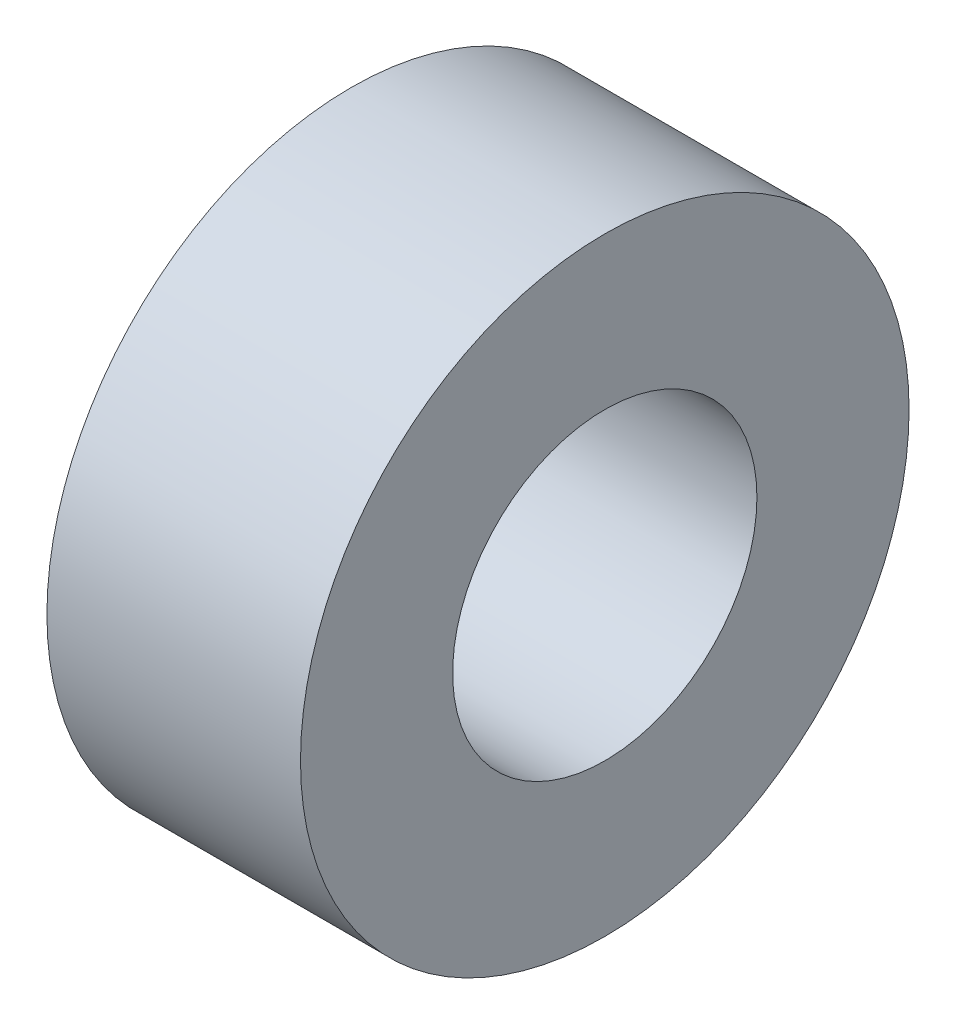
ISO-10303-21;
HEADER;
FILE_DESCRIPTION(('STEP AP214'),'2;1');
FILE_NAME('part.step','',(''),(''),'','','');
FILE_SCHEMA(('AUTOMOTIVE_DESIGN { 1 0 10303 214 1 1 1 1 }'));
ENDSEC;
DATA;
#1=APPLICATION_CONTEXT('core data for automotive mechanical design processes');
#2=APPLICATION_PROTOCOL_DEFINITION('international standard','automotive_design',2000,#1);
#3=PRODUCT_CONTEXT('',#1,'mechanical');
#4=PRODUCT('Part','Part','',(#3));
#5=PRODUCT_RELATED_PRODUCT_CATEGORY('part','',(#4));
#6=PRODUCT_DEFINITION_FORMATION('','',#4);
#7=PRODUCT_DEFINITION_CONTEXT('part definition',#1,'design');
#8=PRODUCT_DEFINITION('design','',#6,#7);
#9=PRODUCT_DEFINITION_SHAPE('','',#8);
#10=(LENGTH_UNIT() NAMED_UNIT(*) SI_UNIT(.MILLI.,.METRE.));
#11=(NAMED_UNIT(*) PLANE_ANGLE_UNIT() SI_UNIT($,.RADIAN.));
#12=(NAMED_UNIT(*) SI_UNIT($,.STERADIAN.) SOLID_ANGLE_UNIT());
#13=UNCERTAINTY_MEASURE_WITH_UNIT(LENGTH_MEASURE(1.E-05),#10,'distance_accuracy_value','');
#14=(GEOMETRIC_REPRESENTATION_CONTEXT(3) GLOBAL_UNCERTAINTY_ASSIGNED_CONTEXT((#13)) GLOBAL_UNIT_ASSIGNED_CONTEXT((#10,
#11,#12)) REPRESENTATION_CONTEXT('',''));
#15=CARTESIAN_POINT('',(0.,0.,0.));
#16=DIRECTION('',(0.,0.,1.));
#17=DIRECTION('',(1.,0.,0.));
#18=AXIS2_PLACEMENT_3D('',#15,#16,#17);
#19=CARTESIAN_POINT('',(1.25,3.,0.));
#20=DIRECTION('',(-1.,0.,0.));
#21=DIRECTION('',(0.,0.,1.));
#22=AXIS2_PLACEMENT_3D('',#19,#20,#21);
#23=PLANE('',#22);
#24=CARTESIAN_POINT('',(1.25,0.,0.));
#25=DIRECTION('',(1.,0.,0.));
#26=DIRECTION('',(0.,0.,-1.));
#27=AXIS2_PLACEMENT_3D('',#24,#25,#26);
#28=CIRCLE('',#27,1.5);
#29=CARTESIAN_POINT('',(1.25,0.,-1.5));
#30=VERTEX_POINT('',#29);
#31=EDGE_CURVE('E10',#30,#30,#28,.T.);
#32=ORIENTED_EDGE('',*,*,#31,.F.);
#33=EDGE_LOOP('',(#32));
#34=FACE_BOUND('',#33,.T.);
#35=CARTESIAN_POINT('',(1.25,0.,0.));
#36=DIRECTION('',(1.,0.,0.));
#37=DIRECTION('',(0.,0.,-1.));
#38=AXIS2_PLACEMENT_3D('',#35,#36,#37);
#39=CIRCLE('',#38,3.);
#40=CARTESIAN_POINT('',(1.25,0.,-3.));
#41=VERTEX_POINT('',#40);
#42=EDGE_CURVE('E52',#41,#41,#39,.T.);
#43=ORIENTED_EDGE('',*,*,#42,.T.);
#44=EDGE_LOOP('',(#43));
#45=FACE_BOUND('',#44,.T.);
#46=ADVANCED_FACE('F38',(#34,#45),#23,.F.);
#47=CARTESIAN_POINT('',(2.89567247594883,0.,0.));
#48=DIRECTION('',(1.,0.,0.));
#49=DIRECTION('',(0.,0.,-1.));
#50=AXIS2_PLACEMENT_3D('',#47,#48,#49);
#51=CYLINDRICAL_SURFACE('',#50,1.5);
#52=CARTESIAN_POINT('',(-1.25,0.,0.));
#53=DIRECTION('',(1.,0.,0.));
#54=DIRECTION('',(0.,0.,-1.));
#55=AXIS2_PLACEMENT_3D('',#52,#53,#54);
#56=CIRCLE('',#55,1.5);
#57=CARTESIAN_POINT('',(-1.25,0.,-1.5));
#58=VERTEX_POINT('',#57);
#59=EDGE_CURVE('E44',#58,#58,#56,.T.);
#60=ORIENTED_EDGE('',*,*,#59,.F.);
#61=EDGE_LOOP('',(#60));
#62=FACE_BOUND('',#61,.T.);
#63=ORIENTED_EDGE('',*,*,#31,.T.);
#64=EDGE_LOOP('',(#63));
#65=FACE_BOUND('',#64,.T.);
#66=ADVANCED_FACE('F67',(#62,#65),#51,.F.);
#67=CARTESIAN_POINT('',(-1.25,3.,0.));
#68=DIRECTION('',(1.,0.,0.));
#69=DIRECTION('',(0.,0.,-1.));
#70=AXIS2_PLACEMENT_3D('',#67,#68,#69);
#71=PLANE('',#70);
#72=CARTESIAN_POINT('',(-1.25,0.,0.));
#73=DIRECTION('',(1.,0.,0.));
#74=DIRECTION('',(0.,0.,-1.));
#75=AXIS2_PLACEMENT_3D('',#72,#73,#74);
#76=CIRCLE('',#75,3.);
#77=CARTESIAN_POINT('',(-1.25,0.,-3.));
#78=VERTEX_POINT('',#77);
#79=EDGE_CURVE('E48',#78,#78,#76,.T.);
#80=ORIENTED_EDGE('',*,*,#79,.F.);
#81=EDGE_LOOP('',(#80));
#82=FACE_BOUND('',#81,.T.);
#83=ORIENTED_EDGE('',*,*,#59,.T.);
#84=EDGE_LOOP('',(#83));
#85=FACE_BOUND('',#84,.T.);
#86=ADVANCED_FACE('F62',(#82,#85),#71,.F.);
#87=CARTESIAN_POINT('',(2.89567247594883,0.,0.));
#88=DIRECTION('',(1.,0.,0.));
#89=DIRECTION('',(0.,0.,-1.));
#90=AXIS2_PLACEMENT_3D('',#87,#88,#89);
#91=CYLINDRICAL_SURFACE('',#90,3.);
#92=ORIENTED_EDGE('',*,*,#42,.F.);
#93=EDGE_LOOP('',(#92));
#94=FACE_BOUND('',#93,.T.);
#95=ORIENTED_EDGE('',*,*,#79,.T.);
#96=EDGE_LOOP('',(#95));
#97=FACE_BOUND('',#96,.T.);
#98=ADVANCED_FACE('F59',(#94,#97),#91,.T.);
#99=CLOSED_SHELL('',(#46,#66,#86,#98));
#100=MANIFOLD_SOLID_BREP('B2',#99);
#101=ADVANCED_BREP_SHAPE_REPRESENTATION('',(#18,#100),#14);
#102=SHAPE_DEFINITION_REPRESENTATION(#9,#101);
ENDSEC;
END-ISO-10303-21;
